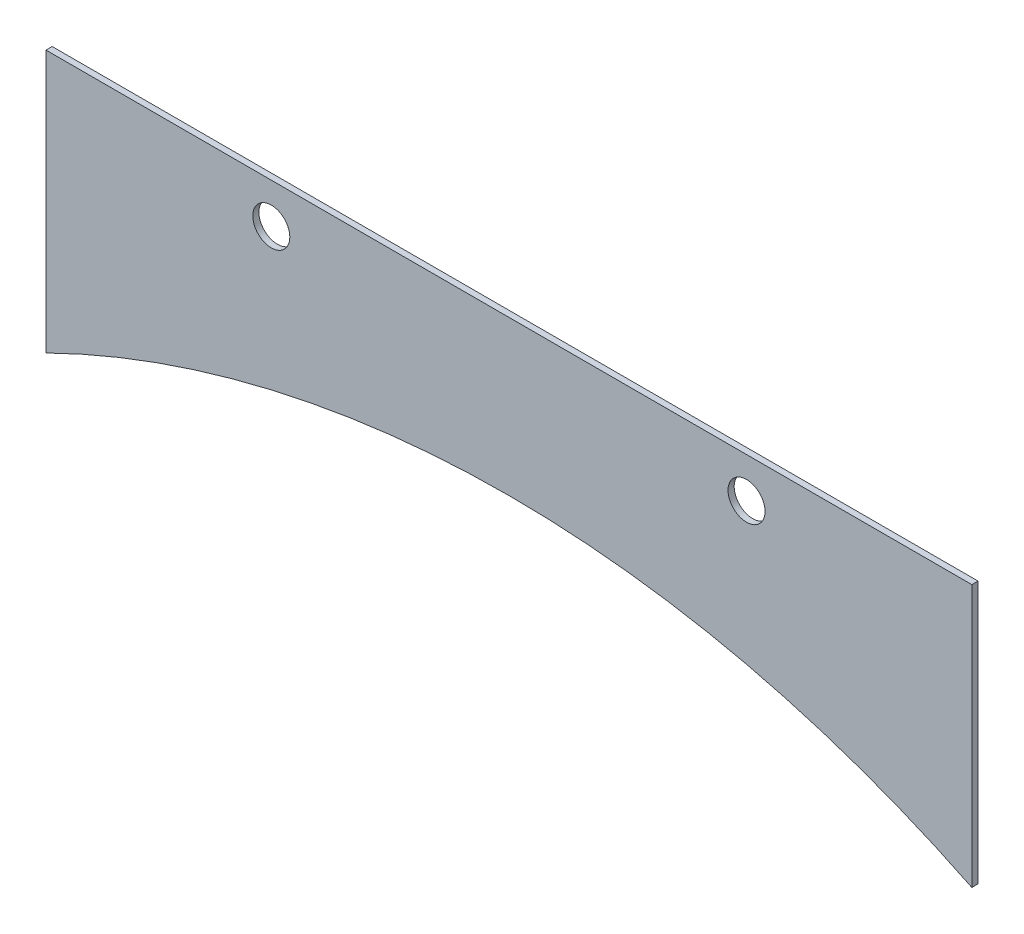
ISO-10303-21;
HEADER;
FILE_DESCRIPTION(('STEP AP214'),'2;1');
FILE_NAME('part.step','',(''),(''),'','','');
FILE_SCHEMA(('AUTOMOTIVE_DESIGN { 1 0 10303 214 1 1 1 1 }'));
ENDSEC;
DATA;
#1=APPLICATION_CONTEXT('core data for automotive mechanical design processes');
#2=APPLICATION_PROTOCOL_DEFINITION('international standard','automotive_design',2000,#1);
#3=PRODUCT_CONTEXT('',#1,'mechanical');
#4=PRODUCT('Part','Part','',(#3));
#5=PRODUCT_RELATED_PRODUCT_CATEGORY('part','',(#4));
#6=PRODUCT_DEFINITION_FORMATION('','',#4);
#7=PRODUCT_DEFINITION_CONTEXT('part definition',#1,'design');
#8=PRODUCT_DEFINITION('design','',#6,#7);
#9=PRODUCT_DEFINITION_SHAPE('','',#8);
#10=(LENGTH_UNIT() NAMED_UNIT(*) SI_UNIT(.MILLI.,.METRE.));
#11=(NAMED_UNIT(*) PLANE_ANGLE_UNIT() SI_UNIT($,.RADIAN.));
#12=(NAMED_UNIT(*) SI_UNIT($,.STERADIAN.) SOLID_ANGLE_UNIT());
#13=UNCERTAINTY_MEASURE_WITH_UNIT(LENGTH_MEASURE(1.E-05),#10,'distance_accuracy_value','');
#14=(GEOMETRIC_REPRESENTATION_CONTEXT(3) GLOBAL_UNCERTAINTY_ASSIGNED_CONTEXT((#13)) GLOBAL_UNIT_ASSIGNED_CONTEXT((#10,
#11,#12)) REPRESENTATION_CONTEXT('',''));
#15=CARTESIAN_POINT('',(0.,0.,0.));
#16=DIRECTION('',(0.,0.,1.));
#17=DIRECTION('',(1.,0.,0.));
#18=AXIS2_PLACEMENT_3D('',#15,#16,#17);
#19=CARTESIAN_POINT('',(0.,-303.928571428572,2.));
#20=DIRECTION('',(0.,0.,-1.));
#21=DIRECTION('',(-1.,0.,0.));
#22=AXIS2_PLACEMENT_3D('',#19,#20,#21);
#23=CYLINDRICAL_SURFACE('',#22,338.928571428572);
#24=CARTESIAN_POINT('',(0.,-303.928571428572,0.));
#25=DIRECTION('',(0.,0.,-1.));
#26=DIRECTION('',(1.,0.,0.));
#27=AXIS2_PLACEMENT_3D('',#24,#25,#26);
#28=CIRCLE('',#27,338.928571428572);
#29=CARTESIAN_POINT('',(-150.,0.,0.));
#30=VERTEX_POINT('',#29);
#31=CARTESIAN_POINT('',(150.,0.,0.));
#32=VERTEX_POINT('',#31);
#33=EDGE_CURVE('E113',#30,#32,#28,.T.);
#34=ORIENTED_EDGE('',*,*,#33,.T.);
#35=DIRECTION('',(0.,0.,-1.));
#36=VECTOR('',#35,1.);
#37=CARTESIAN_POINT('',(150.,0.,2.));
#38=LINE('',#37,#36);
#39=CARTESIAN_POINT('',(150.,0.,2.));
#40=VERTEX_POINT('',#39);
#41=EDGE_CURVE('E11',#40,#32,#38,.T.);
#42=ORIENTED_EDGE('',*,*,#41,.F.);
#43=CARTESIAN_POINT('',(0.,-303.928571428572,2.));
#44=DIRECTION('',(0.,0.,-1.));
#45=DIRECTION('',(1.,0.,0.));
#46=AXIS2_PLACEMENT_3D('',#43,#44,#45);
#47=CIRCLE('',#46,338.928571428572);
#48=CARTESIAN_POINT('',(-150.,0.,2.));
#49=VERTEX_POINT('',#48);
#50=EDGE_CURVE('E97',#49,#40,#47,.T.);
#51=ORIENTED_EDGE('',*,*,#50,.F.);
#52=DIRECTION('',(0.,0.,-1.));
#53=VECTOR('',#52,1.);
#54=CARTESIAN_POINT('',(-150.,0.,2.));
#55=LINE('',#54,#53);
#56=EDGE_CURVE('E109',#49,#30,#55,.T.);
#57=ORIENTED_EDGE('',*,*,#56,.T.);
#58=EDGE_LOOP('',(#34,#42,#51,#57));
#59=FACE_BOUND('',#58,.T.);
#60=ADVANCED_FACE('F45',(#59),#23,.F.);
#61=CARTESIAN_POINT('',(150.,85.,2.));
#62=DIRECTION('',(-1.,0.,0.));
#63=DIRECTION('',(0.,0.,1.));
#64=AXIS2_PLACEMENT_3D('',#61,#62,#63);
#65=PLANE('',#64);
#66=DIRECTION('',(0.,1.,0.));
#67=VECTOR('',#66,1.);
#68=CARTESIAN_POINT('',(150.,85.,0.));
#69=LINE('',#68,#67);
#70=CARTESIAN_POINT('',(150.,85.,0.));
#71=VERTEX_POINT('',#70);
#72=EDGE_CURVE('E102',#32,#71,#69,.T.);
#73=ORIENTED_EDGE('',*,*,#72,.T.);
#74=DIRECTION('',(0.,0.,-1.));
#75=VECTOR('',#74,1.);
#76=CARTESIAN_POINT('',(150.,85.,2.));
#77=LINE('',#76,#75);
#78=CARTESIAN_POINT('',(150.,85.,2.));
#79=VERTEX_POINT('',#78);
#80=EDGE_CURVE('E54',#79,#71,#77,.T.);
#81=ORIENTED_EDGE('',*,*,#80,.F.);
#82=DIRECTION('',(0.,1.,0.));
#83=VECTOR('',#82,1.);
#84=CARTESIAN_POINT('',(150.,85.,2.));
#85=LINE('',#84,#83);
#86=EDGE_CURVE('E92',#40,#79,#85,.T.);
#87=ORIENTED_EDGE('',*,*,#86,.F.);
#88=ORIENTED_EDGE('',*,*,#41,.T.);
#89=EDGE_LOOP('',(#73,#81,#87,#88));
#90=FACE_BOUND('',#89,.T.);
#91=ADVANCED_FACE('F101',(#90),#65,.F.);
#92=CARTESIAN_POINT('',(-150.,85.,2.));
#93=DIRECTION('',(0.,-1.,0.));
#94=DIRECTION('',(0.,0.,-1.));
#95=AXIS2_PLACEMENT_3D('',#92,#93,#94);
#96=PLANE('',#95);
#97=DIRECTION('',(-1.,0.,0.));
#98=VECTOR('',#97,1.);
#99=CARTESIAN_POINT('',(-150.,85.,0.));
#100=LINE('',#99,#98);
#101=CARTESIAN_POINT('',(-150.,85.,0.));
#102=VERTEX_POINT('',#101);
#103=EDGE_CURVE('E79',#71,#102,#100,.T.);
#104=ORIENTED_EDGE('',*,*,#103,.T.);
#105=DIRECTION('',(0.,0.,-1.));
#106=VECTOR('',#105,1.);
#107=CARTESIAN_POINT('',(-150.,85.,2.));
#108=LINE('',#107,#106);
#109=CARTESIAN_POINT('',(-150.,85.,2.));
#110=VERTEX_POINT('',#109);
#111=EDGE_CURVE('E104',#110,#102,#108,.T.);
#112=ORIENTED_EDGE('',*,*,#111,.F.);
#113=DIRECTION('',(-1.,0.,0.));
#114=VECTOR('',#113,1.);
#115=CARTESIAN_POINT('',(-150.,85.,2.));
#116=LINE('',#115,#114);
#117=EDGE_CURVE('E95',#79,#110,#116,.T.);
#118=ORIENTED_EDGE('',*,*,#117,.F.);
#119=ORIENTED_EDGE('',*,*,#80,.T.);
#120=EDGE_LOOP('',(#104,#112,#118,#119));
#121=FACE_BOUND('',#120,.T.);
#122=ADVANCED_FACE('F105',(#121),#96,.F.);
#123=CARTESIAN_POINT('',(-150.,0.,2.));
#124=DIRECTION('',(1.,0.,0.));
#125=DIRECTION('',(0.,1.,0.));
#126=AXIS2_PLACEMENT_3D('',#123,#124,#125);
#127=PLANE('',#126);
#128=DIRECTION('',(0.,-1.,0.));
#129=VECTOR('',#128,1.);
#130=CARTESIAN_POINT('',(-150.,0.,0.));
#131=LINE('',#130,#129);
#132=EDGE_CURVE('E85',#102,#30,#131,.T.);
#133=ORIENTED_EDGE('',*,*,#132,.T.);
#134=ORIENTED_EDGE('',*,*,#56,.F.);
#135=DIRECTION('',(0.,-1.,0.));
#136=VECTOR('',#135,1.);
#137=CARTESIAN_POINT('',(-150.,0.,2.));
#138=LINE('',#137,#136);
#139=EDGE_CURVE('E62',#110,#49,#138,.T.);
#140=ORIENTED_EDGE('',*,*,#139,.F.);
#141=ORIENTED_EDGE('',*,*,#111,.T.);
#142=EDGE_LOOP('',(#133,#134,#140,#141));
#143=FACE_BOUND('',#142,.T.);
#144=ADVANCED_FACE('F127',(#143),#127,.F.);
#145=CARTESIAN_POINT('',(0.,-303.928571428572,2.));
#146=DIRECTION('',(0.,0.,1.));
#147=DIRECTION('',(1.,0.,0.));
#148=AXIS2_PLACEMENT_3D('',#145,#146,#147);
#149=PLANE('',#148);
#150=CARTESIAN_POINT('',(-77.,72.,2.));
#151=DIRECTION('',(0.,0.,1.));
#152=DIRECTION('',(1.,0.,0.));
#153=AXIS2_PLACEMENT_3D('',#150,#151,#152);
#154=CIRCLE('',#153,6.);
#155=CARTESIAN_POINT('',(-71.,72.,2.));
#156=VERTEX_POINT('',#155);
#157=EDGE_CURVE('E142',#156,#156,#154,.T.);
#158=ORIENTED_EDGE('',*,*,#157,.F.);
#159=EDGE_LOOP('',(#158));
#160=FACE_BOUND('',#159,.T.);
#161=CARTESIAN_POINT('',(77.,72.,2.));
#162=DIRECTION('',(0.,0.,1.));
#163=DIRECTION('',(1.,0.,0.));
#164=AXIS2_PLACEMENT_3D('',#161,#162,#163);
#165=CIRCLE('',#164,6.00000000000002);
#166=CARTESIAN_POINT('',(83.,72.,2.));
#167=VERTEX_POINT('',#166);
#168=EDGE_CURVE('E138',#167,#167,#165,.T.);
#169=ORIENTED_EDGE('',*,*,#168,.F.);
#170=EDGE_LOOP('',(#169));
#171=FACE_BOUND('',#170,.T.);
#172=ORIENTED_EDGE('',*,*,#50,.T.);
#173=ORIENTED_EDGE('',*,*,#86,.T.);
#174=ORIENTED_EDGE('',*,*,#117,.T.);
#175=ORIENTED_EDGE('',*,*,#139,.T.);
#176=EDGE_LOOP('',(#172,#173,#174,#175));
#177=FACE_BOUND('',#176,.T.);
#178=ADVANCED_FACE('F93',(#160,#171,#177),#149,.T.);
#179=CARTESIAN_POINT('',(0.,-303.928571428572,0.));
#180=DIRECTION('',(0.,0.,1.));
#181=DIRECTION('',(1.,0.,0.));
#182=AXIS2_PLACEMENT_3D('',#179,#180,#181);
#183=PLANE('',#182);
#184=CARTESIAN_POINT('',(-77.,72.,0.));
#185=DIRECTION('',(0.,0.,1.));
#186=DIRECTION('',(1.,0.,0.));
#187=AXIS2_PLACEMENT_3D('',#184,#185,#186);
#188=CIRCLE('',#187,6.);
#189=CARTESIAN_POINT('',(-71.,72.,0.));
#190=VERTEX_POINT('',#189);
#191=EDGE_CURVE('E117',#190,#190,#188,.T.);
#192=ORIENTED_EDGE('',*,*,#191,.T.);
#193=EDGE_LOOP('',(#192));
#194=FACE_BOUND('',#193,.T.);
#195=CARTESIAN_POINT('',(77.,72.,0.));
#196=DIRECTION('',(0.,0.,1.));
#197=DIRECTION('',(1.,0.,0.));
#198=AXIS2_PLACEMENT_3D('',#195,#196,#197);
#199=CIRCLE('',#198,6.00000000000002);
#200=CARTESIAN_POINT('',(83.,72.,0.));
#201=VERTEX_POINT('',#200);
#202=EDGE_CURVE('E134',#201,#201,#199,.T.);
#203=ORIENTED_EDGE('',*,*,#202,.T.);
#204=EDGE_LOOP('',(#203));
#205=FACE_BOUND('',#204,.T.);
#206=ORIENTED_EDGE('',*,*,#33,.F.);
#207=ORIENTED_EDGE('',*,*,#132,.F.);
#208=ORIENTED_EDGE('',*,*,#103,.F.);
#209=ORIENTED_EDGE('',*,*,#72,.F.);
#210=EDGE_LOOP('',(#206,#207,#208,#209));
#211=FACE_BOUND('',#210,.T.);
#212=ADVANCED_FACE('F130',(#194,#205,#211),#183,.F.);
#213=CARTESIAN_POINT('',(77.,72.,0.));
#214=DIRECTION('',(0.,0.,1.));
#215=DIRECTION('',(1.,0.,0.));
#216=AXIS2_PLACEMENT_3D('',#213,#214,#215);
#217=CYLINDRICAL_SURFACE('',#216,6.00000000000002);
#218=ORIENTED_EDGE('',*,*,#202,.F.);
#219=EDGE_LOOP('',(#218));
#220=FACE_BOUND('',#219,.T.);
#221=ORIENTED_EDGE('',*,*,#168,.T.);
#222=EDGE_LOOP('',(#221));
#223=FACE_BOUND('',#222,.T.);
#224=ADVANCED_FACE('F155',(#220,#223),#217,.F.);
#225=CARTESIAN_POINT('',(-77.,72.,0.));
#226=DIRECTION('',(0.,0.,1.));
#227=DIRECTION('',(1.,0.,0.));
#228=AXIS2_PLACEMENT_3D('',#225,#226,#227);
#229=CYLINDRICAL_SURFACE('',#228,6.);
#230=ORIENTED_EDGE('',*,*,#191,.F.);
#231=EDGE_LOOP('',(#230));
#232=FACE_BOUND('',#231,.T.);
#233=ORIENTED_EDGE('',*,*,#157,.T.);
#234=EDGE_LOOP('',(#233));
#235=FACE_BOUND('',#234,.T.);
#236=ADVANCED_FACE('F152',(#232,#235),#229,.F.);
#237=CLOSED_SHELL('',(#60,#91,#122,#144,#178,#212,#224,#236));
#238=MANIFOLD_SOLID_BREP('B2',#237);
#239=ADVANCED_BREP_SHAPE_REPRESENTATION('',(#18,#238),#14);
#240=SHAPE_DEFINITION_REPRESENTATION(#9,#239);
ENDSEC;
END-ISO-10303-21;
